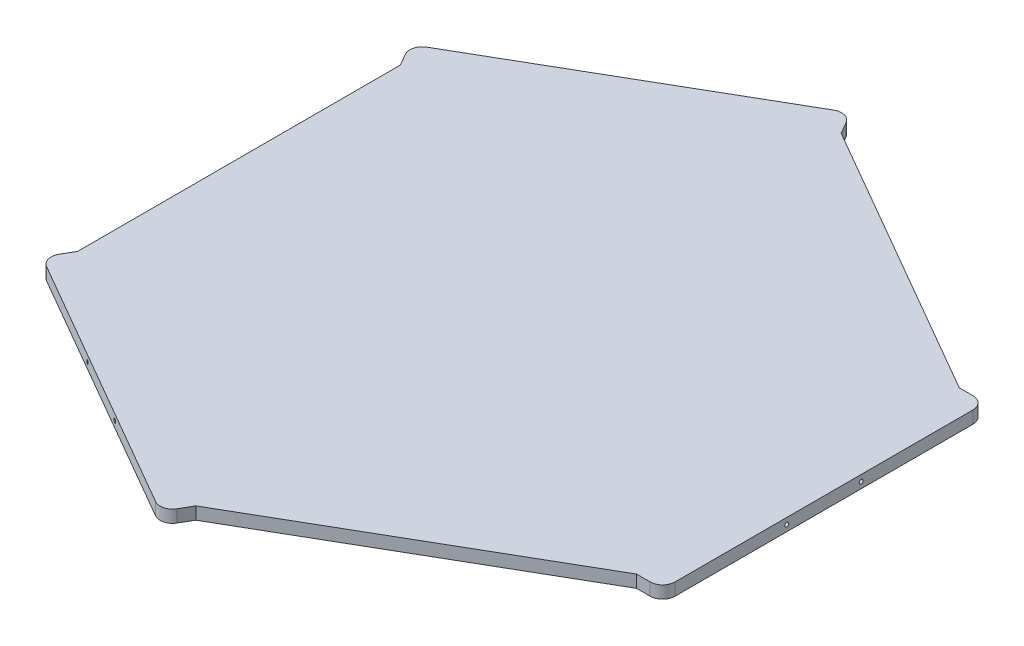
ISO-10303-21;
HEADER;
FILE_DESCRIPTION(('STEP AP214'),'2;1');
FILE_NAME('part.step','',(''),(''),'','','');
FILE_SCHEMA(('AUTOMOTIVE_DESIGN { 1 0 10303 214 1 1 1 1 }'));
ENDSEC;
DATA;
#1=APPLICATION_CONTEXT('core data for automotive mechanical design processes');
#2=APPLICATION_PROTOCOL_DEFINITION('international standard','automotive_design',2000,#1);
#3=PRODUCT_CONTEXT('',#1,'mechanical');
#4=PRODUCT('Part','Part','',(#3));
#5=PRODUCT_RELATED_PRODUCT_CATEGORY('part','',(#4));
#6=PRODUCT_DEFINITION_FORMATION('','',#4);
#7=PRODUCT_DEFINITION_CONTEXT('part definition',#1,'design');
#8=PRODUCT_DEFINITION('design','',#6,#7);
#9=PRODUCT_DEFINITION_SHAPE('','',#8);
#10=(LENGTH_UNIT() NAMED_UNIT(*) SI_UNIT(.MILLI.,.METRE.));
#11=(NAMED_UNIT(*) PLANE_ANGLE_UNIT() SI_UNIT($,.RADIAN.));
#12=(NAMED_UNIT(*) SI_UNIT($,.STERADIAN.) SOLID_ANGLE_UNIT());
#13=UNCERTAINTY_MEASURE_WITH_UNIT(LENGTH_MEASURE(1.E-05),#10,'distance_accuracy_value','');
#14=(GEOMETRIC_REPRESENTATION_CONTEXT(3) GLOBAL_UNCERTAINTY_ASSIGNED_CONTEXT((#13)) GLOBAL_UNIT_ASSIGNED_CONTEXT((#10,
#11,#12)) REPRESENTATION_CONTEXT('',''));
#15=CARTESIAN_POINT('',(0.,0.,0.));
#16=DIRECTION('',(0.,0.,1.));
#17=DIRECTION('',(1.,0.,0.));
#18=AXIS2_PLACEMENT_3D('',#15,#16,#17);
#19=CARTESIAN_POINT('',(56.2916512459885,5.,-97.5));
#20=DIRECTION('',(-0.5,0.,0.866025403784439));
#21=DIRECTION('',(0.866025403784439,0.,0.5));
#22=AXIS2_PLACEMENT_3D('',#19,#20,#21);
#23=PLANE('',#22);
#24=DIRECTION('',(-0.866025403784439,0.,-0.5));
#25=VECTOR('',#24,1.);
#26=CARTESIAN_POINT('',(56.2916512459885,0.,-97.5));
#27=LINE('',#26,#25);
#28=CARTESIAN_POINT('',(112.583302491977,0.,-65.));
#29=VERTEX_POINT('',#28);
#30=CARTESIAN_POINT('',(0.,0.,-130.));
#31=VERTEX_POINT('',#30);
#32=EDGE_CURVE('E216',#29,#31,#27,.T.);
#33=ORIENTED_EDGE('',*,*,#32,.T.);
#34=DIRECTION('',(0.,-1.,0.));
#35=VECTOR('',#34,1.);
#36=CARTESIAN_POINT('',(0.,5.,-130.));
#37=LINE('',#36,#35);
#38=CARTESIAN_POINT('',(0.,5.,-130.));
#39=VERTEX_POINT('',#38);
#40=EDGE_CURVE('E11',#39,#31,#37,.T.);
#41=ORIENTED_EDGE('',*,*,#40,.F.);
#42=DIRECTION('',(-0.866025403784439,0.,-0.5));
#43=VECTOR('',#42,1.);
#44=CARTESIAN_POINT('',(56.2916512459885,5.,-97.5));
#45=LINE('',#44,#43);
#46=CARTESIAN_POINT('',(112.583302491977,5.,-65.));
#47=VERTEX_POINT('',#46);
#48=EDGE_CURVE('E281',#47,#39,#45,.T.);
#49=ORIENTED_EDGE('',*,*,#48,.F.);
#50=DIRECTION('',(0.,-1.,0.));
#51=VECTOR('',#50,1.);
#52=CARTESIAN_POINT('',(112.583302491977,5.,-65.));
#53=LINE('',#52,#51);
#54=EDGE_CURVE('E66',#47,#29,#53,.T.);
#55=ORIENTED_EDGE('',*,*,#54,.T.);
#56=EDGE_LOOP('',(#33,#41,#49,#55));
#57=FACE_BOUND('',#56,.T.);
#58=ADVANCED_FACE('F49',(#57),#23,.F.);
#59=CARTESIAN_POINT('',(56.2916512459889,5.,-32.5000000000006));
#60=DIRECTION('',(-0.866025403784436,0.,0.500000000000004));
#61=DIRECTION('',(0.500000000000004,0.,0.866025403784436));
#62=AXIS2_PLACEMENT_3D('',#59,#60,#61);
#63=PLANE('',#62);
#64=DIRECTION('',(-0.500000000000005,0.,-0.866025403784436));
#65=VECTOR('',#64,1.);
#66=CARTESIAN_POINT('',(56.2916512459889,0.,-32.5000000000006));
#67=LINE('',#66,#65);
#68=CARTESIAN_POINT('',(-2.75,0.,-134.763139720814));
#69=VERTEX_POINT('',#68);
#70=EDGE_CURVE('E219',#31,#69,#67,.T.);
#71=ORIENTED_EDGE('',*,*,#70,.T.);
#72=DIRECTION('',(0.,-1.,0.));
#73=VECTOR('',#72,1.);
#74=CARTESIAN_POINT('',(-2.75,5.,-134.763139720814));
#75=LINE('',#74,#73);
#76=CARTESIAN_POINT('',(-2.75,5.,-134.763139720814));
#77=VERTEX_POINT('',#76);
#78=EDGE_CURVE('E58',#77,#69,#75,.T.);
#79=ORIENTED_EDGE('',*,*,#78,.F.);
#80=DIRECTION('',(-0.500000000000005,0.,-0.866025403784436));
#81=VECTOR('',#80,1.);
#82=CARTESIAN_POINT('',(56.2916512459889,5.,-32.5000000000006));
#83=LINE('',#82,#81);
#84=EDGE_CURVE('E136',#39,#77,#83,.T.);
#85=ORIENTED_EDGE('',*,*,#84,.F.);
#86=ORIENTED_EDGE('',*,*,#40,.T.);
#87=EDGE_LOOP('',(#71,#79,#85,#86));
#88=FACE_BOUND('',#87,.T.);
#89=ADVANCED_FACE('F334',(#88),#63,.F.);
#90=CARTESIAN_POINT('',(-7.0801270189222,5.,-132.263139720814));
#91=DIRECTION('',(0.,-1.,0.));
#92=DIRECTION('',(0.,0.,-1.));
#93=AXIS2_PLACEMENT_3D('',#90,#91,#92);
#94=CYLINDRICAL_SURFACE('',#93,4.99999999999998);
#95=CARTESIAN_POINT('',(-7.0801270189222,0.,-132.263139720814));
#96=DIRECTION('',(0.,1.,0.));
#97=DIRECTION('',(0.,0.,1.));
#98=AXIS2_PLACEMENT_3D('',#95,#96,#97);
#99=CIRCLE('',#98,4.99999999999998);
#100=CARTESIAN_POINT('',(-9.58012701892218,0.,-136.593266739737));
#101=VERTEX_POINT('',#100);
#102=EDGE_CURVE('E224',#101,#69,#99,.F.);
#103=ORIENTED_EDGE('',*,*,#102,.F.);
#104=DIRECTION('',(0.,-1.,0.));
#105=VECTOR('',#104,1.);
#106=CARTESIAN_POINT('',(-9.58012701892218,5.,-136.593266739737));
#107=LINE('',#106,#105);
#108=CARTESIAN_POINT('',(-9.58012701892218,5.,-136.593266739737));
#109=VERTEX_POINT('',#108);
#110=EDGE_CURVE('E325',#109,#101,#107,.T.);
#111=ORIENTED_EDGE('',*,*,#110,.F.);
#112=CARTESIAN_POINT('',(-7.0801270189222,5.,-132.263139720814));
#113=DIRECTION('',(0.,1.,0.));
#114=DIRECTION('',(0.,0.,1.));
#115=AXIS2_PLACEMENT_3D('',#112,#113,#114);
#116=CIRCLE('',#115,4.99999999999998);
#117=EDGE_CURVE('E333',#109,#77,#116,.F.);
#118=ORIENTED_EDGE('',*,*,#117,.T.);
#119=ORIENTED_EDGE('',*,*,#78,.T.);
#120=EDGE_LOOP('',(#103,#111,#118,#119));
#121=FACE_BOUND('',#120,.T.);
#122=ADVANCED_FACE('F331',(#121),#94,.T.);
#123=CARTESIAN_POINT('',(-61.5416512459885,5.,-106.593266739737));
#124=DIRECTION('',(0.5,0.,0.866025403784439));
#125=DIRECTION('',(0.866025403784439,0.,-0.5));
#126=AXIS2_PLACEMENT_3D('',#123,#124,#125);
#127=PLANE('',#126);
#128=CARTESIAN_POINT('',(-74.5320323027551,2.49999999999999,-99.0932667397366));
#129=DIRECTION('',(-0.5,0.,-0.866025403784439));
#130=DIRECTION('',(-0.866025403784439,0.,0.5));
#131=AXIS2_PLACEMENT_3D('',#128,#129,#130);
#132=CIRCLE('',#131,0.79999999999999);
#133=CARTESIAN_POINT('',(-75.2248526257826,2.49999999999999,-98.6932667397366));
#134=VERTEX_POINT('',#133);
#135=EDGE_CURVE('E439',#134,#134,#132,.T.);
#136=ORIENTED_EDGE('',*,*,#135,.F.);
#137=EDGE_LOOP('',(#136));
#138=FACE_BOUND('',#137,.T.);
#139=CARTESIAN_POINT('',(-48.5512701892219,2.49999999999999,-114.093266739737));
#140=DIRECTION('',(-0.5,0.,-0.866025403784439));
#141=DIRECTION('',(-0.866025403784439,0.,0.5));
#142=AXIS2_PLACEMENT_3D('',#139,#140,#141);
#143=CIRCLE('',#142,0.79999999999999);
#144=CARTESIAN_POINT('',(-49.2440905122495,2.49999999999999,-113.693266739737));
#145=VERTEX_POINT('',#144);
#146=EDGE_CURVE('E431',#145,#145,#143,.T.);
#147=ORIENTED_EDGE('',*,*,#146,.F.);
#148=EDGE_LOOP('',(#147));
#149=FACE_BOUND('',#148,.T.);
#150=DIRECTION('',(-0.866025403784439,0.,0.5));
#151=VECTOR('',#150,1.);
#152=CARTESIAN_POINT('',(-61.5416512459885,0.,-106.593266739737));
#153=LINE('',#152,#151);
#154=CARTESIAN_POINT('',(-113.503175473055,0.,-76.5932667397366));
#155=VERTEX_POINT('',#154);
#156=EDGE_CURVE('E228',#101,#155,#153,.T.);
#157=ORIENTED_EDGE('',*,*,#156,.T.);
#158=DIRECTION('',(0.,-1.,0.));
#159=VECTOR('',#158,1.);
#160=CARTESIAN_POINT('',(-113.503175473055,5.,-76.5932667397366));
#161=LINE('',#160,#159);
#162=CARTESIAN_POINT('',(-113.503175473055,5.,-76.5932667397366));
#163=VERTEX_POINT('',#162);
#164=EDGE_CURVE('E322',#163,#155,#161,.T.);
#165=ORIENTED_EDGE('',*,*,#164,.F.);
#166=DIRECTION('',(-0.866025403784439,0.,0.5));
#167=VECTOR('',#166,1.);
#168=CARTESIAN_POINT('',(-61.5416512459885,5.,-106.593266739737));
#169=LINE('',#168,#167);
#170=EDGE_CURVE('E345',#109,#163,#169,.T.);
#171=ORIENTED_EDGE('',*,*,#170,.F.);
#172=ORIENTED_EDGE('',*,*,#110,.T.);
#173=EDGE_LOOP('',(#157,#165,#171,#172));
#174=FACE_BOUND('',#173,.T.);
#175=ADVANCED_FACE('F342',(#138,#149,#174),#127,.F.);
#176=CARTESIAN_POINT('',(-111.003175473055,5.,-72.2631397208145));
#177=DIRECTION('',(0.,-1.,0.));
#178=DIRECTION('',(0.,0.,-1.));
#179=AXIS2_PLACEMENT_3D('',#176,#177,#178);
#180=CYLINDRICAL_SURFACE('',#179,5.);
#181=CARTESIAN_POINT('',(-111.003175473055,0.,-72.2631397208145));
#182=DIRECTION('',(0.,1.,0.));
#183=DIRECTION('',(0.,0.,1.));
#184=AXIS2_PLACEMENT_3D('',#181,#182,#183);
#185=CIRCLE('',#184,5.);
#186=CARTESIAN_POINT('',(-115.333302491977,0.,-69.7631397208145));
#187=VERTEX_POINT('',#186);
#188=EDGE_CURVE('E232',#187,#155,#185,.F.);
#189=ORIENTED_EDGE('',*,*,#188,.F.);
#190=DIRECTION('',(0.,-1.,0.));
#191=VECTOR('',#190,1.);
#192=CARTESIAN_POINT('',(-115.333302491977,5.,-69.7631397208145));
#193=LINE('',#192,#191);
#194=CARTESIAN_POINT('',(-115.333302491977,5.,-69.7631397208145));
#195=VERTEX_POINT('',#194);
#196=EDGE_CURVE('E319',#195,#187,#193,.T.);
#197=ORIENTED_EDGE('',*,*,#196,.F.);
#198=CARTESIAN_POINT('',(-111.003175473055,5.,-72.2631397208145));
#199=DIRECTION('',(0.,1.,0.));
#200=DIRECTION('',(0.,0.,1.));
#201=AXIS2_PLACEMENT_3D('',#198,#199,#200);
#202=CIRCLE('',#201,5.);
#203=EDGE_CURVE('E348',#195,#163,#202,.F.);
#204=ORIENTED_EDGE('',*,*,#203,.T.);
#205=ORIENTED_EDGE('',*,*,#164,.T.);
#206=EDGE_LOOP('',(#189,#197,#204,#205));
#207=FACE_BOUND('',#206,.T.);
#208=ADVANCED_FACE('F499',(#207),#180,.T.);
#209=CARTESIAN_POINT('',(-56.2916512459882,5.,32.5));
#210=DIRECTION('',(-0.866025403784437,0.,0.500000000000002));
#211=DIRECTION('',(0.500000000000002,0.,0.866025403784437));
#212=AXIS2_PLACEMENT_3D('',#209,#210,#211);
#213=PLANE('',#212);
#214=DIRECTION('',(-0.500000000000002,0.,-0.866025403784437));
#215=VECTOR('',#214,1.);
#216=CARTESIAN_POINT('',(-56.2916512459882,0.,32.5));
#217=LINE('',#216,#215);
#218=CARTESIAN_POINT('',(-112.583302491977,0.,-65.));
#219=VERTEX_POINT('',#218);
#220=EDGE_CURVE('E236',#219,#187,#217,.T.);
#221=ORIENTED_EDGE('',*,*,#220,.F.);
#222=DIRECTION('',(0.,-1.,0.));
#223=VECTOR('',#222,1.);
#224=CARTESIAN_POINT('',(-112.583302491977,5.,-65.));
#225=LINE('',#224,#223);
#226=CARTESIAN_POINT('',(-112.583302491977,5.,-65.));
#227=VERTEX_POINT('',#226);
#228=EDGE_CURVE('E316',#227,#219,#225,.T.);
#229=ORIENTED_EDGE('',*,*,#228,.F.);
#230=DIRECTION('',(-0.500000000000002,0.,-0.866025403784437));
#231=VECTOR('',#230,1.);
#232=CARTESIAN_POINT('',(-56.2916512459882,5.,32.5));
#233=LINE('',#232,#231);
#234=EDGE_CURVE('E358',#227,#195,#233,.T.);
#235=ORIENTED_EDGE('',*,*,#234,.T.);
#236=ORIENTED_EDGE('',*,*,#196,.T.);
#237=EDGE_LOOP('',(#221,#229,#235,#236));
#238=FACE_BOUND('',#237,.T.);
#239=ADVANCED_FACE('F497',(#238),#213,.T.);
#240=CARTESIAN_POINT('',(-112.583302491977,5.,0.));
#241=DIRECTION('',(1.,0.,0.));
#242=DIRECTION('',(0.,0.,-1.));
#243=AXIS2_PLACEMENT_3D('',#240,#241,#242);
#244=PLANE('',#243);
#245=DIRECTION('',(0.,0.,1.));
#246=VECTOR('',#245,1.);
#247=CARTESIAN_POINT('',(-112.583302491977,0.,0.));
#248=LINE('',#247,#246);
#249=CARTESIAN_POINT('',(-112.583302491977,0.,65.));
#250=VERTEX_POINT('',#249);
#251=EDGE_CURVE('E240',#219,#250,#248,.T.);
#252=ORIENTED_EDGE('',*,*,#251,.T.);
#253=DIRECTION('',(0.,-1.,0.));
#254=VECTOR('',#253,1.);
#255=CARTESIAN_POINT('',(-112.583302491977,5.,65.));
#256=LINE('',#255,#254);
#257=CARTESIAN_POINT('',(-112.583302491977,5.,65.));
#258=VERTEX_POINT('',#257);
#259=EDGE_CURVE('E312',#258,#250,#256,.T.);
#260=ORIENTED_EDGE('',*,*,#259,.F.);
#261=DIRECTION('',(0.,0.,1.));
#262=VECTOR('',#261,1.);
#263=CARTESIAN_POINT('',(-112.583302491977,5.,0.));
#264=LINE('',#263,#262);
#265=EDGE_CURVE('E362',#227,#258,#264,.T.);
#266=ORIENTED_EDGE('',*,*,#265,.F.);
#267=ORIENTED_EDGE('',*,*,#228,.T.);
#268=EDGE_LOOP('',(#252,#260,#266,#267));
#269=FACE_BOUND('',#268,.T.);
#270=ADVANCED_FACE('F494',(#269),#244,.F.);
#271=CARTESIAN_POINT('',(-56.2916512459885,5.,-32.5));
#272=DIRECTION('',(0.866025403784439,0.,0.5));
#273=DIRECTION('',(0.5,0.,-0.866025403784439));
#274=AXIS2_PLACEMENT_3D('',#271,#272,#273);
#275=PLANE('',#274);
#276=DIRECTION('',(-0.5,0.,0.866025403784439));
#277=VECTOR('',#276,1.);
#278=CARTESIAN_POINT('',(-56.2916512459885,0.,-32.5));
#279=LINE('',#278,#277);
#280=CARTESIAN_POINT('',(-115.333302491977,0.,69.7631397208144));
#281=VERTEX_POINT('',#280);
#282=EDGE_CURVE('E243',#250,#281,#279,.T.);
#283=ORIENTED_EDGE('',*,*,#282,.T.);
#284=DIRECTION('',(0.,-1.,0.));
#285=VECTOR('',#284,1.);
#286=CARTESIAN_POINT('',(-115.333302491977,5.,69.7631397208144));
#287=LINE('',#286,#285);
#288=CARTESIAN_POINT('',(-115.333302491977,5.,69.7631397208144));
#289=VERTEX_POINT('',#288);
#290=EDGE_CURVE('E309',#289,#281,#287,.T.);
#291=ORIENTED_EDGE('',*,*,#290,.F.);
#292=DIRECTION('',(-0.5,0.,0.866025403784439));
#293=VECTOR('',#292,1.);
#294=CARTESIAN_POINT('',(-56.2916512459885,5.,-32.5));
#295=LINE('',#294,#293);
#296=EDGE_CURVE('E365',#258,#289,#295,.T.);
#297=ORIENTED_EDGE('',*,*,#296,.F.);
#298=ORIENTED_EDGE('',*,*,#259,.T.);
#299=EDGE_LOOP('',(#283,#291,#297,#298));
#300=FACE_BOUND('',#299,.T.);
#301=ADVANCED_FACE('F490',(#300),#275,.F.);
#302=CARTESIAN_POINT('',(-111.003175473055,5.,72.2631397208144));
#303=DIRECTION('',(0.,-1.,0.));
#304=DIRECTION('',(0.,0.,-1.));
#305=AXIS2_PLACEMENT_3D('',#302,#303,#304);
#306=CYLINDRICAL_SURFACE('',#305,4.99999999999999);
#307=CARTESIAN_POINT('',(-111.003175473055,0.,72.2631397208144));
#308=DIRECTION('',(0.,1.,0.));
#309=DIRECTION('',(0.,0.,1.));
#310=AXIS2_PLACEMENT_3D('',#307,#308,#309);
#311=CIRCLE('',#310,4.99999999999999);
#312=CARTESIAN_POINT('',(-113.503175473055,0.,76.5932667397366));
#313=VERTEX_POINT('',#312);
#314=EDGE_CURVE('E247',#313,#281,#311,.F.);
#315=ORIENTED_EDGE('',*,*,#314,.F.);
#316=DIRECTION('',(0.,-1.,0.));
#317=VECTOR('',#316,1.);
#318=CARTESIAN_POINT('',(-113.503175473055,5.,76.5932667397366));
#319=LINE('',#318,#317);
#320=CARTESIAN_POINT('',(-113.503175473055,5.,76.5932667397366));
#321=VERTEX_POINT('',#320);
#322=EDGE_CURVE('E306',#321,#313,#319,.T.);
#323=ORIENTED_EDGE('',*,*,#322,.F.);
#324=CARTESIAN_POINT('',(-111.003175473055,5.,72.2631397208144));
#325=DIRECTION('',(0.,1.,0.));
#326=DIRECTION('',(0.,0.,1.));
#327=AXIS2_PLACEMENT_3D('',#324,#325,#326);
#328=CIRCLE('',#327,4.99999999999999);
#329=EDGE_CURVE('E368',#321,#289,#328,.F.);
#330=ORIENTED_EDGE('',*,*,#329,.T.);
#331=ORIENTED_EDGE('',*,*,#290,.T.);
#332=EDGE_LOOP('',(#315,#323,#330,#331));
#333=FACE_BOUND('',#332,.T.);
#334=ADVANCED_FACE('F466',(#333),#306,.T.);
#335=CARTESIAN_POINT('',(-61.5416512459885,5.,106.593266739737));
#336=DIRECTION('',(0.5,0.,-0.866025403784439));
#337=DIRECTION('',(-0.866025403784439,0.,-0.5));
#338=AXIS2_PLACEMENT_3D('',#335,#336,#337);
#339=PLANE('',#338);
#340=CARTESIAN_POINT('',(-48.5512701892219,2.5,114.093266739737));
#341=DIRECTION('',(-0.5,0.,0.866025403784438));
#342=DIRECTION('',(0.866025403784439,0.,0.5));
#343=AXIS2_PLACEMENT_3D('',#340,#341,#342);
#344=CIRCLE('',#343,0.79999999999999);
#345=CARTESIAN_POINT('',(-47.8584498661944,2.5,114.493266739737));
#346=VERTEX_POINT('',#345);
#347=EDGE_CURVE('E455',#346,#346,#344,.T.);
#348=ORIENTED_EDGE('',*,*,#347,.F.);
#349=EDGE_LOOP('',(#348));
#350=FACE_BOUND('',#349,.T.);
#351=CARTESIAN_POINT('',(-74.5320323027551,2.5,99.0932667397366));
#352=DIRECTION('',(-0.5,0.,0.866025403784438));
#353=DIRECTION('',(0.866025403784439,0.,0.5));
#354=AXIS2_PLACEMENT_3D('',#351,#352,#353);
#355=CIRCLE('',#354,0.79999999999999);
#356=CARTESIAN_POINT('',(-73.8392119797276,2.5,99.4932667397366));
#357=VERTEX_POINT('',#356);
#358=EDGE_CURVE('E447',#357,#357,#355,.T.);
#359=ORIENTED_EDGE('',*,*,#358,.F.);
#360=EDGE_LOOP('',(#359));
#361=FACE_BOUND('',#360,.T.);
#362=DIRECTION('',(0.866025403784439,0.,0.5));
#363=VECTOR('',#362,1.);
#364=CARTESIAN_POINT('',(-61.5416512459885,0.,106.593266739737));
#365=LINE('',#364,#363);
#366=CARTESIAN_POINT('',(-9.58012701892222,0.,136.593266739737));
#367=VERTEX_POINT('',#366);
#368=EDGE_CURVE('E251',#313,#367,#365,.T.);
#369=ORIENTED_EDGE('',*,*,#368,.T.);
#370=DIRECTION('',(0.,-1.,0.));
#371=VECTOR('',#370,1.);
#372=CARTESIAN_POINT('',(-9.58012701892222,5.,136.593266739737));
#373=LINE('',#372,#371);
#374=CARTESIAN_POINT('',(-9.58012701892222,5.,136.593266739737));
#375=VERTEX_POINT('',#374);
#376=EDGE_CURVE('E302',#375,#367,#373,.T.);
#377=ORIENTED_EDGE('',*,*,#376,.F.);
#378=DIRECTION('',(0.866025403784439,0.,0.5));
#379=VECTOR('',#378,1.);
#380=CARTESIAN_POINT('',(-61.5416512459885,5.,106.593266739737));
#381=LINE('',#380,#379);
#382=EDGE_CURVE('E372',#321,#375,#381,.T.);
#383=ORIENTED_EDGE('',*,*,#382,.F.);
#384=ORIENTED_EDGE('',*,*,#322,.T.);
#385=EDGE_LOOP('',(#369,#377,#383,#384));
#386=FACE_BOUND('',#385,.T.);
#387=ADVANCED_FACE('F462',(#350,#361,#386),#339,.F.);
#388=CARTESIAN_POINT('',(-7.08012701892223,5.,132.263139720814));
#389=DIRECTION('',(0.,-1.,0.));
#390=DIRECTION('',(0.,0.,-1.));
#391=AXIS2_PLACEMENT_3D('',#388,#389,#390);
#392=CYLINDRICAL_SURFACE('',#391,5.);
#393=CARTESIAN_POINT('',(-7.08012701892223,0.,132.263139720814));
#394=DIRECTION('',(0.,1.,0.));
#395=DIRECTION('',(0.,0.,1.));
#396=AXIS2_PLACEMENT_3D('',#393,#394,#395);
#397=CIRCLE('',#396,5.);
#398=CARTESIAN_POINT('',(-2.75000000000003,0.,134.763139720814));
#399=VERTEX_POINT('',#398);
#400=EDGE_CURVE('E254',#367,#399,#397,.T.);
#401=ORIENTED_EDGE('',*,*,#400,.T.);
#402=DIRECTION('',(0.,-1.,0.));
#403=VECTOR('',#402,1.);
#404=CARTESIAN_POINT('',(-2.75000000000003,5.,134.763139720814));
#405=LINE('',#404,#403);
#406=CARTESIAN_POINT('',(-2.75000000000003,5.,134.763139720814));
#407=VERTEX_POINT('',#406);
#408=EDGE_CURVE('E299',#407,#399,#405,.T.);
#409=ORIENTED_EDGE('',*,*,#408,.F.);
#410=CARTESIAN_POINT('',(-7.08012701892223,5.,132.263139720814));
#411=DIRECTION('',(0.,1.,0.));
#412=DIRECTION('',(0.,0.,1.));
#413=AXIS2_PLACEMENT_3D('',#410,#411,#412);
#414=CIRCLE('',#413,5.);
#415=EDGE_CURVE('E375',#375,#407,#414,.T.);
#416=ORIENTED_EDGE('',*,*,#415,.F.);
#417=ORIENTED_EDGE('',*,*,#376,.T.);
#418=EDGE_LOOP('',(#401,#409,#416,#417));
#419=FACE_BOUND('',#418,.T.);
#420=ADVANCED_FACE('F465',(#419),#392,.T.);
#421=CARTESIAN_POINT('',(56.2916512459888,5.,32.5000000000006));
#422=DIRECTION('',(0.866025403784436,0.,0.500000000000004));
#423=DIRECTION('',(0.500000000000004,0.,-0.866025403784436));
#424=AXIS2_PLACEMENT_3D('',#421,#422,#423);
#425=PLANE('',#424);
#426=DIRECTION('',(-0.500000000000004,0.,0.866025403784436));
#427=VECTOR('',#426,1.);
#428=CARTESIAN_POINT('',(56.2916512459888,0.,32.5000000000006));
#429=LINE('',#428,#427);
#430=CARTESIAN_POINT('',(0.,0.,130.));
#431=VERTEX_POINT('',#430);
#432=EDGE_CURVE('E258',#431,#399,#429,.T.);
#433=ORIENTED_EDGE('',*,*,#432,.F.);
#434=DIRECTION('',(0.,-1.,0.));
#435=VECTOR('',#434,1.);
#436=CARTESIAN_POINT('',(0.,5.,130.));
#437=LINE('',#436,#435);
#438=CARTESIAN_POINT('',(0.,5.,130.));
#439=VERTEX_POINT('',#438);
#440=EDGE_CURVE('E296',#439,#431,#437,.T.);
#441=ORIENTED_EDGE('',*,*,#440,.F.);
#442=DIRECTION('',(-0.500000000000004,0.,0.866025403784436));
#443=VECTOR('',#442,1.);
#444=CARTESIAN_POINT('',(56.2916512459888,5.,32.5000000000006));
#445=LINE('',#444,#443);
#446=EDGE_CURVE('E378',#439,#407,#445,.T.);
#447=ORIENTED_EDGE('',*,*,#446,.T.);
#448=ORIENTED_EDGE('',*,*,#408,.T.);
#449=EDGE_LOOP('',(#433,#441,#447,#448));
#450=FACE_BOUND('',#449,.T.);
#451=ADVANCED_FACE('F481',(#450),#425,.T.);
#452=CARTESIAN_POINT('',(56.2916512459885,5.,97.5000000000001));
#453=DIRECTION('',(-0.5,0.,-0.866025403784439));
#454=DIRECTION('',(-0.866025403784439,0.,0.5));
#455=AXIS2_PLACEMENT_3D('',#452,#453,#454);
#456=PLANE('',#455);
#457=DIRECTION('',(0.866025403784439,0.,-0.5));
#458=VECTOR('',#457,1.);
#459=CARTESIAN_POINT('',(56.2916512459885,0.,97.5000000000001));
#460=LINE('',#459,#458);
#461=CARTESIAN_POINT('',(112.583302491977,0.,65.0000000000001));
#462=VERTEX_POINT('',#461);
#463=EDGE_CURVE('E262',#431,#462,#460,.T.);
#464=ORIENTED_EDGE('',*,*,#463,.T.);
#465=DIRECTION('',(0.,-1.,0.));
#466=VECTOR('',#465,1.);
#467=CARTESIAN_POINT('',(112.583302491977,5.,65.0000000000001));
#468=LINE('',#467,#466);
#469=CARTESIAN_POINT('',(112.583302491977,5.,65.0000000000001));
#470=VERTEX_POINT('',#469);
#471=EDGE_CURVE('E292',#470,#462,#468,.T.);
#472=ORIENTED_EDGE('',*,*,#471,.F.);
#473=DIRECTION('',(0.866025403784439,0.,-0.5));
#474=VECTOR('',#473,1.);
#475=CARTESIAN_POINT('',(56.2916512459885,5.,97.5000000000001));
#476=LINE('',#475,#474);
#477=EDGE_CURVE('E382',#439,#470,#476,.T.);
#478=ORIENTED_EDGE('',*,*,#477,.F.);
#479=ORIENTED_EDGE('',*,*,#440,.T.);
#480=EDGE_LOOP('',(#464,#472,#478,#479));
#481=FACE_BOUND('',#480,.T.);
#482=ADVANCED_FACE('F722',(#481),#456,.F.);
#483=CARTESIAN_POINT('',(4.9203065864071E-13,5.,65.0000000000009));
#484=DIRECTION('',(0.,0.,-1.));
#485=DIRECTION('',(-1.,0.,0.));
#486=AXIS2_PLACEMENT_3D('',#483,#484,#485);
#487=PLANE('',#486);
#488=DIRECTION('',(1.,0.,0.));
#489=VECTOR('',#488,1.);
#490=CARTESIAN_POINT('',(4.9203065864071E-13,0.,65.0000000000009));
#491=LINE('',#490,#489);
#492=CARTESIAN_POINT('',(118.083302491977,0.,65.));
#493=VERTEX_POINT('',#492);
#494=EDGE_CURVE('E265',#462,#493,#491,.T.);
#495=ORIENTED_EDGE('',*,*,#494,.T.);
#496=DIRECTION('',(0.,-1.,0.));
#497=VECTOR('',#496,1.);
#498=CARTESIAN_POINT('',(118.083302491977,5.,65.));
#499=LINE('',#498,#497);
#500=CARTESIAN_POINT('',(118.083302491977,5.,65.));
#501=VERTEX_POINT('',#500);
#502=EDGE_CURVE('E288',#501,#493,#499,.T.);
#503=ORIENTED_EDGE('',*,*,#502,.F.);
#504=DIRECTION('',(1.,0.,0.));
#505=VECTOR('',#504,1.);
#506=CARTESIAN_POINT('',(4.9203065864071E-13,5.,65.0000000000009));
#507=LINE('',#506,#505);
#508=EDGE_CURVE('E210',#470,#501,#507,.T.);
#509=ORIENTED_EDGE('',*,*,#508,.F.);
#510=ORIENTED_EDGE('',*,*,#471,.T.);
#511=EDGE_LOOP('',(#495,#503,#509,#510));
#512=FACE_BOUND('',#511,.T.);
#513=ADVANCED_FACE('F391',(#512),#487,.F.);
#514=CARTESIAN_POINT('',(118.083302491977,5.,60.));
#515=DIRECTION('',(0.,-1.,0.));
#516=DIRECTION('',(0.,0.,-1.));
#517=AXIS2_PLACEMENT_3D('',#514,#515,#516);
#518=CYLINDRICAL_SURFACE('',#517,4.99999999999999);
#519=CARTESIAN_POINT('',(118.083302491977,0.,60.));
#520=DIRECTION('',(0.,1.,0.));
#521=DIRECTION('',(0.,0.,1.));
#522=AXIS2_PLACEMENT_3D('',#519,#520,#521);
#523=CIRCLE('',#522,4.99999999999999);
#524=CARTESIAN_POINT('',(123.083302491977,0.,60.));
#525=VERTEX_POINT('',#524);
#526=EDGE_CURVE('E268',#493,#525,#523,.T.);
#527=ORIENTED_EDGE('',*,*,#526,.T.);
#528=DIRECTION('',(0.,-1.,0.));
#529=VECTOR('',#528,1.);
#530=CARTESIAN_POINT('',(123.083302491977,5.,60.));
#531=LINE('',#530,#529);
#532=CARTESIAN_POINT('',(123.083302491977,5.,60.));
#533=VERTEX_POINT('',#532);
#534=EDGE_CURVE('E194',#533,#525,#531,.T.);
#535=ORIENTED_EDGE('',*,*,#534,.F.);
#536=CARTESIAN_POINT('',(118.083302491977,5.,60.));
#537=DIRECTION('',(0.,1.,0.));
#538=DIRECTION('',(0.,0.,1.));
#539=AXIS2_PLACEMENT_3D('',#536,#537,#538);
#540=CIRCLE('',#539,4.99999999999999);
#541=EDGE_CURVE('E205',#501,#533,#540,.T.);
#542=ORIENTED_EDGE('',*,*,#541,.F.);
#543=ORIENTED_EDGE('',*,*,#502,.T.);
#544=EDGE_LOOP('',(#527,#535,#542,#543));
#545=FACE_BOUND('',#544,.T.);
#546=ADVANCED_FACE('F395',(#545),#518,.T.);
#547=CARTESIAN_POINT('',(123.083302491977,5.,0.));
#548=DIRECTION('',(1.,0.,0.));
#549=DIRECTION('',(0.,0.,-1.));
#550=AXIS2_PLACEMENT_3D('',#547,#548,#549);
#551=PLANE('',#550);
#552=CARTESIAN_POINT('',(123.083302491977,2.5,15.));
#553=DIRECTION('',(1.,0.,0.));
#554=DIRECTION('',(0.,0.,-1.));
#555=AXIS2_PLACEMENT_3D('',#552,#553,#554);
#556=CIRCLE('',#555,0.79999999999999);
#557=CARTESIAN_POINT('',(123.083302491977,2.5,14.2));
#558=VERTEX_POINT('',#557);
#559=EDGE_CURVE('E423',#558,#558,#556,.T.);
#560=ORIENTED_EDGE('',*,*,#559,.F.);
#561=EDGE_LOOP('',(#560));
#562=FACE_BOUND('',#561,.T.);
#563=CARTESIAN_POINT('',(123.083302491977,2.5,-15.));
#564=DIRECTION('',(1.,0.,0.));
#565=DIRECTION('',(0.,0.,-1.));
#566=AXIS2_PLACEMENT_3D('',#563,#564,#565);
#567=CIRCLE('',#566,0.79999999999999);
#568=CARTESIAN_POINT('',(123.083302491977,2.5,-15.8));
#569=VERTEX_POINT('',#568);
#570=EDGE_CURVE('E415',#569,#569,#567,.T.);
#571=ORIENTED_EDGE('',*,*,#570,.F.);
#572=EDGE_LOOP('',(#571));
#573=FACE_BOUND('',#572,.T.);
#574=DIRECTION('',(0.,0.,1.));
#575=VECTOR('',#574,1.);
#576=CARTESIAN_POINT('',(123.083302491977,0.,0.));
#577=LINE('',#576,#575);
#578=CARTESIAN_POINT('',(123.083302491977,0.,-60.0000000000001));
#579=VERTEX_POINT('',#578);
#580=EDGE_CURVE('E190',#579,#525,#577,.T.);
#581=ORIENTED_EDGE('',*,*,#580,.F.);
#582=DIRECTION('',(0.,-1.,0.));
#583=VECTOR('',#582,1.);
#584=CARTESIAN_POINT('',(123.083302491977,5.,-60.0000000000001));
#585=LINE('',#584,#583);
#586=CARTESIAN_POINT('',(123.083302491977,5.,-60.0000000000001));
#587=VERTEX_POINT('',#586);
#588=EDGE_CURVE('E184',#587,#579,#585,.T.);
#589=ORIENTED_EDGE('',*,*,#588,.F.);
#590=DIRECTION('',(0.,0.,1.));
#591=VECTOR('',#590,1.);
#592=CARTESIAN_POINT('',(123.083302491977,5.,0.));
#593=LINE('',#592,#591);
#594=EDGE_CURVE('E188',#587,#533,#593,.T.);
#595=ORIENTED_EDGE('',*,*,#594,.T.);
#596=ORIENTED_EDGE('',*,*,#534,.T.);
#597=EDGE_LOOP('',(#581,#589,#595,#596));
#598=FACE_BOUND('',#597,.T.);
#599=ADVANCED_FACE('F186',(#562,#573,#598),#551,.T.);
#600=CARTESIAN_POINT('',(118.083302491977,5.,-60.0000000000001));
#601=DIRECTION('',(0.,-1.,0.));
#602=DIRECTION('',(0.,0.,-1.));
#603=AXIS2_PLACEMENT_3D('',#600,#601,#602);
#604=CYLINDRICAL_SURFACE('',#603,5.);
#605=CARTESIAN_POINT('',(118.083302491977,0.,-60.0000000000001));
#606=DIRECTION('',(0.,1.,0.));
#607=DIRECTION('',(0.,0.,1.));
#608=AXIS2_PLACEMENT_3D('',#605,#606,#607);
#609=CIRCLE('',#608,5.);
#610=CARTESIAN_POINT('',(118.083302491977,0.,-65.0000000000001));
#611=VERTEX_POINT('',#610);
#612=EDGE_CURVE('E274',#579,#611,#609,.T.);
#613=ORIENTED_EDGE('',*,*,#612,.T.);
#614=DIRECTION('',(0.,-1.,0.));
#615=VECTOR('',#614,1.);
#616=CARTESIAN_POINT('',(118.083302491977,5.,-65.0000000000001));
#617=LINE('',#616,#615);
#618=CARTESIAN_POINT('',(118.083302491977,5.,-65.0000000000001));
#619=VERTEX_POINT('',#618);
#620=EDGE_CURVE('E124',#619,#611,#617,.T.);
#621=ORIENTED_EDGE('',*,*,#620,.F.);
#622=CARTESIAN_POINT('',(118.083302491977,5.,-60.0000000000001));
#623=DIRECTION('',(0.,1.,0.));
#624=DIRECTION('',(0.,0.,1.));
#625=AXIS2_PLACEMENT_3D('',#622,#623,#624);
#626=CIRCLE('',#625,5.);
#627=EDGE_CURVE('E196',#587,#619,#626,.T.);
#628=ORIENTED_EDGE('',*,*,#627,.F.);
#629=ORIENTED_EDGE('',*,*,#588,.T.);
#630=EDGE_LOOP('',(#613,#621,#628,#629));
#631=FACE_BOUND('',#630,.T.);
#632=ADVANCED_FACE('F197',(#631),#604,.T.);
#633=CARTESIAN_POINT('',(-9.84061317281382E-13,5.,-64.9999999999983));
#634=DIRECTION('',(0.,0.,-1.));
#635=DIRECTION('',(-1.,0.,0.));
#636=AXIS2_PLACEMENT_3D('',#633,#634,#635);
#637=PLANE('',#636);
#638=DIRECTION('',(1.,0.,0.));
#639=VECTOR('',#638,1.);
#640=CARTESIAN_POINT('',(-9.84061317281382E-13,0.,-64.9999999999983));
#641=LINE('',#640,#639);
#642=EDGE_CURVE('E277',#29,#611,#641,.T.);
#643=ORIENTED_EDGE('',*,*,#642,.F.);
#644=ORIENTED_EDGE('',*,*,#54,.F.);
#645=DIRECTION('',(1.,0.,0.));
#646=VECTOR('',#645,1.);
#647=CARTESIAN_POINT('',(-9.84061317281382E-13,5.,-64.9999999999983));
#648=LINE('',#647,#646);
#649=EDGE_CURVE('E201',#47,#619,#648,.T.);
#650=ORIENTED_EDGE('',*,*,#649,.T.);
#651=ORIENTED_EDGE('',*,*,#620,.T.);
#652=EDGE_LOOP('',(#643,#644,#650,#651));
#653=FACE_BOUND('',#652,.T.);
#654=ADVANCED_FACE('F396',(#653),#637,.T.);
#655=CARTESIAN_POINT('',(0.,5.,0.));
#656=DIRECTION('',(0.,1.,0.));
#657=DIRECTION('',(0.,0.,1.));
#658=AXIS2_PLACEMENT_3D('',#655,#656,#657);
#659=PLANE('',#658);
#660=ORIENTED_EDGE('',*,*,#48,.T.);
#661=ORIENTED_EDGE('',*,*,#84,.T.);
#662=ORIENTED_EDGE('',*,*,#117,.F.);
#663=ORIENTED_EDGE('',*,*,#170,.T.);
#664=ORIENTED_EDGE('',*,*,#203,.F.);
#665=ORIENTED_EDGE('',*,*,#234,.F.);
#666=ORIENTED_EDGE('',*,*,#265,.T.);
#667=ORIENTED_EDGE('',*,*,#296,.T.);
#668=ORIENTED_EDGE('',*,*,#329,.F.);
#669=ORIENTED_EDGE('',*,*,#382,.T.);
#670=ORIENTED_EDGE('',*,*,#415,.T.);
#671=ORIENTED_EDGE('',*,*,#446,.F.);
#672=ORIENTED_EDGE('',*,*,#477,.T.);
#673=ORIENTED_EDGE('',*,*,#508,.T.);
#674=ORIENTED_EDGE('',*,*,#541,.T.);
#675=ORIENTED_EDGE('',*,*,#594,.F.);
#676=ORIENTED_EDGE('',*,*,#627,.T.);
#677=ORIENTED_EDGE('',*,*,#649,.F.);
#678=EDGE_LOOP('',(#660,#661,#662,#663,#664,#665,#666,#667,#668,#669,#670,#671,#672,#673,#674,
#675,#676,#677));
#679=FACE_BOUND('',#678,.T.);
#680=ADVANCED_FACE('F203',(#679),#659,.T.);
#681=CARTESIAN_POINT('',(0.,0.,0.));
#682=DIRECTION('',(0.,1.,0.));
#683=DIRECTION('',(0.,0.,1.));
#684=AXIS2_PLACEMENT_3D('',#681,#682,#683);
#685=PLANE('',#684);
#686=ORIENTED_EDGE('',*,*,#32,.F.);
#687=ORIENTED_EDGE('',*,*,#642,.T.);
#688=ORIENTED_EDGE('',*,*,#612,.F.);
#689=ORIENTED_EDGE('',*,*,#580,.T.);
#690=ORIENTED_EDGE('',*,*,#526,.F.);
#691=ORIENTED_EDGE('',*,*,#494,.F.);
#692=ORIENTED_EDGE('',*,*,#463,.F.);
#693=ORIENTED_EDGE('',*,*,#432,.T.);
#694=ORIENTED_EDGE('',*,*,#400,.F.);
#695=ORIENTED_EDGE('',*,*,#368,.F.);
#696=ORIENTED_EDGE('',*,*,#314,.T.);
#697=ORIENTED_EDGE('',*,*,#282,.F.);
#698=ORIENTED_EDGE('',*,*,#251,.F.);
#699=ORIENTED_EDGE('',*,*,#220,.T.);
#700=ORIENTED_EDGE('',*,*,#188,.T.);
#701=ORIENTED_EDGE('',*,*,#156,.F.);
#702=ORIENTED_EDGE('',*,*,#102,.T.);
#703=ORIENTED_EDGE('',*,*,#70,.F.);
#704=EDGE_LOOP('',(#686,#687,#688,#689,#690,#691,#692,#693,#694,#695,#696,#697,#698,#699,#700,
#701,#702,#703));
#705=FACE_BOUND('',#704,.T.);
#706=ADVANCED_FACE('F338',(#705),#685,.F.);
#707=CARTESIAN_POINT('',(116.363990987199,2.5,-15.));
#708=DIRECTION('',(1.,0.,0.));
#709=DIRECTION('',(0.,0.,-1.));
#710=AXIS2_PLACEMENT_3D('',#707,#708,#709);
#711=CONICAL_SURFACE('',#710,0.799999999999998,1.02974425867665);
#712=CARTESIAN_POINT('',(115.883302491977,2.5,-15.));
#713=VERTEX_POINT('',#712);
#714=VERTEX_LOOP('',#713);
#715=FACE_BOUND('',#714,.T.);
#716=CARTESIAN_POINT('',(116.363990987199,2.5,-15.));
#717=DIRECTION('',(1.,0.,0.));
#718=DIRECTION('',(0.,0.,-1.));
#719=AXIS2_PLACEMENT_3D('',#716,#717,#718);
#720=CIRCLE('',#719,0.799999999999998);
#721=CARTESIAN_POINT('',(116.363990987199,2.5,-15.8));
#722=VERTEX_POINT('',#721);
#723=EDGE_CURVE('E220',#722,#722,#720,.T.);
#724=ORIENTED_EDGE('',*,*,#723,.T.);
#725=EDGE_LOOP('',(#724));
#726=FACE_BOUND('',#725,.T.);
#727=ADVANCED_FACE('F647',(#715,#726),#711,.F.);
#728=CARTESIAN_POINT('',(123.083302491977,2.5,-15.));
#729=DIRECTION('',(1.,0.,0.));
#730=DIRECTION('',(0.,0.,-1.));
#731=AXIS2_PLACEMENT_3D('',#728,#729,#730);
#732=CYLINDRICAL_SURFACE('',#731,0.799999999999994);
#733=ORIENTED_EDGE('',*,*,#723,.F.);
#734=EDGE_LOOP('',(#733));
#735=FACE_BOUND('',#734,.T.);
#736=ORIENTED_EDGE('',*,*,#570,.T.);
#737=EDGE_LOOP('',(#736));
#738=FACE_BOUND('',#737,.T.);
#739=ADVANCED_FACE('F641',(#735,#738),#732,.F.);
#740=CARTESIAN_POINT('',(116.363990987199,2.5,15.));
#741=DIRECTION('',(1.,0.,0.));
#742=DIRECTION('',(0.,0.,-1.));
#743=AXIS2_PLACEMENT_3D('',#740,#741,#742);
#744=CONICAL_SURFACE('',#743,0.799999999999998,1.02974425867665);
#745=CARTESIAN_POINT('',(115.883302491977,2.5,15.));
#746=VERTEX_POINT('',#745);
#747=VERTEX_LOOP('',#746);
#748=FACE_BOUND('',#747,.T.);
#749=CARTESIAN_POINT('',(116.363990987199,2.5,15.));
#750=DIRECTION('',(1.,0.,0.));
#751=DIRECTION('',(0.,0.,-1.));
#752=AXIS2_PLACEMENT_3D('',#749,#750,#751);
#753=CIRCLE('',#752,0.799999999999998);
#754=CARTESIAN_POINT('',(116.363990987199,2.5,14.2));
#755=VERTEX_POINT('',#754);
#756=EDGE_CURVE('E419',#755,#755,#753,.T.);
#757=ORIENTED_EDGE('',*,*,#756,.T.);
#758=EDGE_LOOP('',(#757));
#759=FACE_BOUND('',#758,.T.);
#760=ADVANCED_FACE('F646',(#748,#759),#744,.F.);
#761=CARTESIAN_POINT('',(123.083302491977,2.5,15.));
#762=DIRECTION('',(1.,0.,0.));
#763=DIRECTION('',(0.,0.,-1.));
#764=AXIS2_PLACEMENT_3D('',#761,#762,#763);
#765=CYLINDRICAL_SURFACE('',#764,0.799999999999994);
#766=ORIENTED_EDGE('',*,*,#756,.F.);
#767=EDGE_LOOP('',(#766));
#768=FACE_BOUND('',#767,.T.);
#769=ORIENTED_EDGE('',*,*,#559,.T.);
#770=EDGE_LOOP('',(#769));
#771=FACE_BOUND('',#770,.T.);
#772=ADVANCED_FACE('F528',(#768,#771),#765,.F.);
#773=CARTESIAN_POINT('',(-45.1916144368329,2.49999999999999,-108.274172280658));
#774=DIRECTION('',(-0.5,0.,-0.866025403784439));
#775=DIRECTION('',(-0.866025403784439,0.,0.5));
#776=AXIS2_PLACEMENT_3D('',#773,#774,#775);
#777=CONICAL_SURFACE('',#776,0.799999999999999,1.02974425867665);
#778=CARTESIAN_POINT('',(-44.9512701892219,2.49999999999999,-107.857883832489));
#779=VERTEX_POINT('',#778);
#780=VERTEX_LOOP('',#779);
#781=FACE_BOUND('',#780,.T.);
#782=CARTESIAN_POINT('',(-45.1916144368329,2.49999999999999,-108.274172280658));
#783=DIRECTION('',(-0.5,0.,-0.866025403784439));
#784=DIRECTION('',(-0.866025403784439,0.,0.5));
#785=AXIS2_PLACEMENT_3D('',#782,#783,#784);
#786=CIRCLE('',#785,0.799999999999999);
#787=CARTESIAN_POINT('',(-45.8844347598605,2.49999999999999,-107.874172280658));
#788=VERTEX_POINT('',#787);
#789=EDGE_CURVE('E427',#788,#788,#786,.T.);
#790=ORIENTED_EDGE('',*,*,#789,.T.);
#791=EDGE_LOOP('',(#790));
#792=FACE_BOUND('',#791,.T.);
#793=ADVANCED_FACE('F544',(#781,#792),#777,.F.);
#794=CARTESIAN_POINT('',(-48.5512701892219,2.49999999999999,-114.093266739737));
#795=DIRECTION('',(-0.5,0.,-0.866025403784439));
#796=DIRECTION('',(-0.866025403784439,0.,0.5));
#797=AXIS2_PLACEMENT_3D('',#794,#795,#796);
#798=CYLINDRICAL_SURFACE('',#797,0.799999999999994);
#799=ORIENTED_EDGE('',*,*,#789,.F.);
#800=EDGE_LOOP('',(#799));
#801=FACE_BOUND('',#800,.T.);
#802=ORIENTED_EDGE('',*,*,#146,.T.);
#803=EDGE_LOOP('',(#802));
#804=FACE_BOUND('',#803,.T.);
#805=ADVANCED_FACE('F549',(#801,#804),#798,.F.);
#806=CARTESIAN_POINT('',(-71.1723765503661,2.49999999999999,-93.2741722806579));
#807=DIRECTION('',(-0.5,0.,-0.866025403784439));
#808=DIRECTION('',(-0.866025403784439,0.,0.5));
#809=AXIS2_PLACEMENT_3D('',#806,#807,#808);
#810=CONICAL_SURFACE('',#809,0.799999999999999,1.02974425867665);
#811=CARTESIAN_POINT('',(-70.9320323027551,2.49999999999999,-92.8578838324887));
#812=VERTEX_POINT('',#811);
#813=VERTEX_LOOP('',#812);
#814=FACE_BOUND('',#813,.T.);
#815=CARTESIAN_POINT('',(-71.1723765503661,2.49999999999999,-93.2741722806579));
#816=DIRECTION('',(-0.5,0.,-0.866025403784439));
#817=DIRECTION('',(-0.866025403784439,0.,0.5));
#818=AXIS2_PLACEMENT_3D('',#815,#816,#817);
#819=CIRCLE('',#818,0.799999999999999);
#820=CARTESIAN_POINT('',(-71.8651968733937,2.49999999999999,-92.8741722806579));
#821=VERTEX_POINT('',#820);
#822=EDGE_CURVE('E435',#821,#821,#819,.T.);
#823=ORIENTED_EDGE('',*,*,#822,.T.);
#824=EDGE_LOOP('',(#823));
#825=FACE_BOUND('',#824,.T.);
#826=ADVANCED_FACE('F562',(#814,#825),#810,.F.);
#827=CARTESIAN_POINT('',(-74.5320323027551,2.49999999999999,-99.0932667397366));
#828=DIRECTION('',(-0.5,0.,-0.866025403784439));
#829=DIRECTION('',(-0.866025403784439,0.,0.5));
#830=AXIS2_PLACEMENT_3D('',#827,#828,#829);
#831=CYLINDRICAL_SURFACE('',#830,0.799999999999994);
#832=ORIENTED_EDGE('',*,*,#822,.F.);
#833=EDGE_LOOP('',(#832));
#834=FACE_BOUND('',#833,.T.);
#835=ORIENTED_EDGE('',*,*,#135,.T.);
#836=EDGE_LOOP('',(#835));
#837=FACE_BOUND('',#836,.T.);
#838=ADVANCED_FACE('F575',(#834,#837),#831,.F.);
#839=CARTESIAN_POINT('',(-71.1723765503661,2.5,93.2741722806578));
#840=DIRECTION('',(-0.5,0.,0.866025403784438));
#841=DIRECTION('',(0.866025403784439,0.,0.5));
#842=AXIS2_PLACEMENT_3D('',#839,#840,#841);
#843=CONICAL_SURFACE('',#842,0.799999999999998,1.02974425867665);
#844=CARTESIAN_POINT('',(-70.9320323027551,2.5,92.8578838324886));
#845=VERTEX_POINT('',#844);
#846=VERTEX_LOOP('',#845);
#847=FACE_BOUND('',#846,.T.);
#848=CARTESIAN_POINT('',(-71.1723765503661,2.5,93.2741722806578));
#849=DIRECTION('',(-0.5,0.,0.866025403784438));
#850=DIRECTION('',(0.866025403784439,0.,0.5));
#851=AXIS2_PLACEMENT_3D('',#848,#849,#850);
#852=CIRCLE('',#851,0.799999999999998);
#853=CARTESIAN_POINT('',(-70.4795562273386,2.5,93.6741722806578));
#854=VERTEX_POINT('',#853);
#855=EDGE_CURVE('E443',#854,#854,#852,.T.);
#856=ORIENTED_EDGE('',*,*,#855,.T.);
#857=EDGE_LOOP('',(#856));
#858=FACE_BOUND('',#857,.T.);
#859=ADVANCED_FACE('F586',(#847,#858),#843,.F.);
#860=CARTESIAN_POINT('',(-74.5320323027551,2.5,99.0932667397366));
#861=DIRECTION('',(-0.5,0.,0.866025403784438));
#862=DIRECTION('',(0.866025403784439,0.,0.5));
#863=AXIS2_PLACEMENT_3D('',#860,#861,#862);
#864=CYLINDRICAL_SURFACE('',#863,0.799999999999994);
#865=CARTESIAN_POINT('',(-70.4795562273386,2.5,93.6741722806578));
#866=CARTESIAN_POINT('',(-70.514552641426,2.5,93.7347878479399));
#867=CARTESIAN_POINT('',(-70.5495490555134,2.5,93.795403415222));
#868=CARTESIAN_POINT('',(-70.6195418836881,2.5,93.9166345497861));
#869=CARTESIAN_POINT('',(-70.6545382977755,2.5,93.9772501170682));
#870=CARTESIAN_POINT('',(-70.7245311259503,2.5,94.0984812516323));
#871=CARTESIAN_POINT('',(-70.7595275400377,2.5,94.1590968189144));
#872=CARTESIAN_POINT('',(-70.8295203682124,2.5,94.2803279534785));
#873=CARTESIAN_POINT('',(-70.8645167822998,2.5,94.3409435207606));
#874=CARTESIAN_POINT('',(-70.9345096104746,2.5,94.4621746553247));
#875=CARTESIAN_POINT('',(-70.969506024562,2.5,94.5227902226068));
#876=CARTESIAN_POINT('',(-71.0394988527368,2.5,94.6440213571709));
#877=CARTESIAN_POINT('',(-71.0744952668241,2.5,94.704636924453));
#878=CARTESIAN_POINT('',(-71.1444880949989,2.5,94.8258680590172));
#879=CARTESIAN_POINT('',(-71.1794845090863,2.5,94.8864836262992));
#880=CARTESIAN_POINT('',(-71.2494773372611,2.5,95.0077147608634));
#881=CARTESIAN_POINT('',(-71.2844737513484,2.5,95.0683303281454));
#882=CARTESIAN_POINT('',(-71.3544665795232,2.5,95.1895614627096));
#883=CARTESIAN_POINT('',(-71.3894629936106,2.5,95.2501770299916));
#884=CARTESIAN_POINT('',(-71.4594558217854,2.5,95.3714081645558));
#885=CARTESIAN_POINT('',(-71.4944522358728,2.5,95.4320237318379));
#886=CARTESIAN_POINT('',(-71.5644450640475,2.5,95.553254866402));
#887=CARTESIAN_POINT('',(-71.5994414781349,2.5,95.6138704336841));
#888=CARTESIAN_POINT('',(-71.6694343063097,2.5,95.7351015682482));
#889=CARTESIAN_POINT('',(-71.7044307203971,2.5,95.7957171355303));
#890=CARTESIAN_POINT('',(-71.7744235485718,2.5,95.9169482700944));
#891=CARTESIAN_POINT('',(-71.8094199626592,2.5,95.9775638373765));
#892=CARTESIAN_POINT('',(-71.879412790834,2.5,96.0987949719406));
#893=CARTESIAN_POINT('',(-71.9144092049214,2.5,96.1594105392227));
#894=CARTESIAN_POINT('',(-71.9844020330962,2.5,96.2806416737868));
#895=CARTESIAN_POINT('',(-72.0193984471835,2.5,96.3412572410689));
#896=CARTESIAN_POINT('',(-72.0893912753583,2.5,96.4624883756331));
#897=CARTESIAN_POINT('',(-72.1243876894457,2.5,96.5231039429151));
#898=CARTESIAN_POINT('',(-72.1943805176205,2.5,96.6443350774793));
#899=CARTESIAN_POINT('',(-72.2293769317078,2.5,96.7049506447613));
#900=CARTESIAN_POINT('',(-72.2993697598826,2.5,96.8261817793255));
#901=CARTESIAN_POINT('',(-72.33436617397,2.5,96.8867973466076));
#902=CARTESIAN_POINT('',(-72.4043590021448,2.5,97.0080284811717));
#903=CARTESIAN_POINT('',(-72.4393554162322,2.5,97.0686440484538));
#904=CARTESIAN_POINT('',(-72.5093482444069,2.5,97.1898751830179));
#905=CARTESIAN_POINT('',(-72.5443446584943,2.5,97.2504907503));
#906=CARTESIAN_POINT('',(-72.6143374866691,2.5,97.3717218848641));
#907=CARTESIAN_POINT('',(-72.6493339007565,2.5,97.4323374521462));
#908=CARTESIAN_POINT('',(-72.7193267289312,2.5,97.5535685867103));
#909=CARTESIAN_POINT('',(-72.7543231430186,2.5,97.6141841539924));
#910=CARTESIAN_POINT('',(-72.8243159711934,2.5,97.7354152885565));
#911=CARTESIAN_POINT('',(-72.8593123852808,2.5,97.7960308558386));
#912=CARTESIAN_POINT('',(-72.9293052134555,2.5,97.9172619904027));
#913=CARTESIAN_POINT('',(-72.9643016275429,2.5,97.9778775576848));
#914=CARTESIAN_POINT('',(-73.0342944557177,2.5,98.0991086922489));
#915=CARTESIAN_POINT('',(-73.0692908698051,2.5,98.159724259531));
#916=CARTESIAN_POINT('',(-73.1392836979798,2.5,98.2809553940952));
#917=CARTESIAN_POINT('',(-73.1742801120672,2.5,98.3415709613772));
#918=CARTESIAN_POINT('',(-73.244272940242,2.5,98.4628020959414));
#919=CARTESIAN_POINT('',(-73.2792693543294,2.5,98.5234176632235));
#920=CARTESIAN_POINT('',(-73.3492621825042,2.5,98.6446487977876));
#921=CARTESIAN_POINT('',(-73.3842585965916,2.5,98.7052643650697));
#922=CARTESIAN_POINT('',(-73.4542514247663,2.5,98.8264954996338));
#923=CARTESIAN_POINT('',(-73.4892478388537,2.5,98.8871110669159));
#924=CARTESIAN_POINT('',(-73.5592406670285,2.5,99.00834220148));
#925=CARTESIAN_POINT('',(-73.5942370811159,2.5,99.0689577687621));
#926=CARTESIAN_POINT('',(-73.6642299092906,2.5,99.1901889033262));
#927=CARTESIAN_POINT('',(-73.699226323378,2.5,99.2508044706083));
#928=CARTESIAN_POINT('',(-73.7692191515528,2.5,99.3720356051724));
#929=CARTESIAN_POINT('',(-73.8042155656402,2.5,99.4326511724545));
#930=CARTESIAN_POINT('',(-73.8392119797276,2.5,99.4932667397366));
#931=B_SPLINE_CURVE_WITH_KNOTS('',3,(#865,#866,#867,#868,#869,#870,#871,#872,#873,#874,#875,
#876,#877,#878,#879,#880,#881,#882,#883,#884,#885,#886,#887,#888,#889,#890,#891,#892,#893,#894,
#895,#896,#897,#898,#899,#900,#901,#902,#903,#904,#905,#906,#907,#908,#909,#910,#911,#912,#913,
#914,#915,#916,#917,#918,#919,#920,#921,#922,#923,#924,#925,#926,#927,#928,#929,#930),
.UNSPECIFIED.,.F.,.F.,(4,2,2,2,2,2,2,2,2,2,2,2,2,2,2,2,2,2,2,2,2,2,2,2,2,2,2,2,2,2,2,2,4),(0.,
0.209978484524306,0.419956969048612,0.62993545357293,0.839913938097235,1.04989242262154,
1.25987090714586,1.46984939167016,1.67982787619448,1.88980636071879,2.09978484524309,
2.30976332976741,2.51974181429172,2.72972029881603,2.93969878334035,3.14967726786465,
3.35965575238897,3.56963423691328,3.77961272143758,3.9895912059619,4.19956969048621,
4.40954817501051,4.61952665953483,4.82950514405914,5.03948362858344,5.24946211310776,
5.45944059763206,5.66941908215638,5.87939756668069,6.089376051205,6.29935453572932,
6.50933302025362,6.71931150477794),.UNSPECIFIED.);
#932=EDGE_CURVE('BSEAM599',#854,#357,#931,.T.);
#933=ORIENTED_EDGE('',*,*,#855,.F.);
#934=ORIENTED_EDGE('',*,*,#358,.T.);
#935=ORIENTED_EDGE('',*,*,#932,.T.);
#936=ORIENTED_EDGE('',*,*,#932,.F.);
#937=EDGE_LOOP('',(#933,#935,#934,#936));
#938=FACE_BOUND('',#937,.T.);
#939=ADVANCED_FACE('F599',(#938),#864,.F.);
#940=CARTESIAN_POINT('',(-45.191614436833,2.5,108.274172280658));
#941=DIRECTION('',(-0.5,0.,0.866025403784438));
#942=DIRECTION('',(0.866025403784439,0.,0.5));
#943=AXIS2_PLACEMENT_3D('',#940,#941,#942);
#944=CONICAL_SURFACE('',#943,0.799999999999998,1.02974425867665);
#945=CARTESIAN_POINT('',(-44.9512701892219,2.5,107.857883832489));
#946=VERTEX_POINT('',#945);
#947=VERTEX_LOOP('',#946);
#948=FACE_BOUND('',#947,.T.);
#949=CARTESIAN_POINT('',(-45.191614436833,2.5,108.274172280658));
#950=DIRECTION('',(-0.5,0.,0.866025403784438));
#951=DIRECTION('',(0.866025403784439,0.,0.5));
#952=AXIS2_PLACEMENT_3D('',#949,#950,#951);
#953=CIRCLE('',#952,0.799999999999998);
#954=CARTESIAN_POINT('',(-44.4987941138054,2.5,108.674172280658));
#955=VERTEX_POINT('',#954);
#956=EDGE_CURVE('E451',#955,#955,#953,.T.);
#957=ORIENTED_EDGE('',*,*,#956,.T.);
#958=EDGE_LOOP('',(#957));
#959=FACE_BOUND('',#958,.T.);
#960=ADVANCED_FACE('F610',(#948,#959),#944,.F.);
#961=CARTESIAN_POINT('',(-48.5512701892219,2.5,114.093266739737));
#962=DIRECTION('',(-0.5,0.,0.866025403784438));
#963=DIRECTION('',(0.866025403784439,0.,0.5));
#964=AXIS2_PLACEMENT_3D('',#961,#962,#963);
#965=CYLINDRICAL_SURFACE('',#964,0.799999999999994);
#966=CARTESIAN_POINT('',(-44.4987941138054,2.5,108.674172280658));
#967=CARTESIAN_POINT('',(-44.5337905278928,2.5,108.73478784794));
#968=CARTESIAN_POINT('',(-44.5687869419802,2.5,108.795403415222));
#969=CARTESIAN_POINT('',(-44.638779770155,2.5,108.916634549786));
#970=CARTESIAN_POINT('',(-44.6737761842423,2.5,108.977250117068));
#971=CARTESIAN_POINT('',(-44.7437690124171,2.5,109.098481251632));
#972=CARTESIAN_POINT('',(-44.7787654265045,2.5,109.159096818914));
#973=CARTESIAN_POINT('',(-44.8487582546793,2.5,109.280327953479));
#974=CARTESIAN_POINT('',(-44.8837546687667,2.5,109.340943520761));
#975=CARTESIAN_POINT('',(-44.9537474969414,2.5,109.462174655325));
#976=CARTESIAN_POINT('',(-44.9887439110288,2.5,109.522790222607));
#977=CARTESIAN_POINT('',(-45.0587367392036,2.5,109.644021357171));
#978=CARTESIAN_POINT('',(-45.093733153291,2.5,109.704636924453));
#979=CARTESIAN_POINT('',(-45.1637259814657,2.5,109.825868059017));
#980=CARTESIAN_POINT('',(-45.1987223955531,2.5,109.886483626299));
#981=CARTESIAN_POINT('',(-45.2687152237279,2.5,110.007714760863));
#982=CARTESIAN_POINT('',(-45.3037116378153,2.5,110.068330328145));
#983=CARTESIAN_POINT('',(-45.3737044659901,2.5,110.18956146271));
#984=CARTESIAN_POINT('',(-45.4087008800774,2.5,110.250177029992));
#985=CARTESIAN_POINT('',(-45.4786937082522,2.5,110.371408164556));
#986=CARTESIAN_POINT('',(-45.5136901223396,2.5,110.432023731838));
#987=CARTESIAN_POINT('',(-45.5836829505144,2.5,110.553254866402));
#988=CARTESIAN_POINT('',(-45.6186793646017,2.5,110.613870433684));
#989=CARTESIAN_POINT('',(-45.6886721927765,2.5,110.735101568248));
#990=CARTESIAN_POINT('',(-45.7236686068639,2.5,110.79571713553));
#991=CARTESIAN_POINT('',(-45.7936614350387,2.5,110.916948270094));
#992=CARTESIAN_POINT('',(-45.8286578491261,2.5,110.977563837377));
#993=CARTESIAN_POINT('',(-45.8986506773008,2.5,111.098794971941));
#994=CARTESIAN_POINT('',(-45.9336470913882,2.5,111.159410539223));
#995=CARTESIAN_POINT('',(-46.003639919563,2.5,111.280641673787));
#996=CARTESIAN_POINT('',(-46.0386363336504,2.5,111.341257241069));
#997=CARTESIAN_POINT('',(-46.1086291618251,2.5,111.462488375633));
#998=CARTESIAN_POINT('',(-46.1436255759125,2.5,111.523103942915));
#999=CARTESIAN_POINT('',(-46.2136184040873,2.5,111.644335077479));
#1000=CARTESIAN_POINT('',(-46.2486148181747,2.5,111.704950644761));
#1001=CARTESIAN_POINT('',(-46.3186076463494,2.5,111.826181779325));
#1002=CARTESIAN_POINT('',(-46.3536040604368,2.5,111.886797346608));
#1003=CARTESIAN_POINT('',(-46.4235968886116,2.5,112.008028481172));
#1004=CARTESIAN_POINT('',(-46.458593302699,2.5,112.068644048454));
#1005=CARTESIAN_POINT('',(-46.5285861308738,2.5,112.189875183018));
#1006=CARTESIAN_POINT('',(-46.5635825449611,2.5,112.2504907503));
#1007=CARTESIAN_POINT('',(-46.6335753731359,2.5,112.371721884864));
#1008=CARTESIAN_POINT('',(-46.6685717872233,2.5,112.432337452146));
#1009=CARTESIAN_POINT('',(-46.7385646153981,2.5,112.55356858671));
#1010=CARTESIAN_POINT('',(-46.7735610294855,2.5,112.614184153992));
#1011=CARTESIAN_POINT('',(-46.8435538576602,2.5,112.735415288557));
#1012=CARTESIAN_POINT('',(-46.8785502717476,2.5,112.796030855839));
#1013=CARTESIAN_POINT('',(-46.9485430999224,2.5,112.917261990403));
#1014=CARTESIAN_POINT('',(-46.9835395140098,2.5,112.977877557685));
#1015=CARTESIAN_POINT('',(-47.0535323421845,2.5,113.099108692249));
#1016=CARTESIAN_POINT('',(-47.0885287562719,2.5,113.159724259531));
#1017=CARTESIAN_POINT('',(-47.1585215844467,2.5,113.280955394095));
#1018=CARTESIAN_POINT('',(-47.1935179985341,2.5,113.341570961377));
#1019=CARTESIAN_POINT('',(-47.2635108267088,2.5,113.462802095941));
#1020=CARTESIAN_POINT('',(-47.2985072407962,2.5,113.523417663223));
#1021=CARTESIAN_POINT('',(-47.368500068971,2.5,113.644648797788));
#1022=CARTESIAN_POINT('',(-47.4034964830584,2.5,113.70526436507));
#1023=CARTESIAN_POINT('',(-47.4734893112332,2.5,113.826495499634));
#1024=CARTESIAN_POINT('',(-47.5084857253205,2.5,113.887111066916));
#1025=CARTESIAN_POINT('',(-47.5784785534953,2.5,114.00834220148));
#1026=CARTESIAN_POINT('',(-47.6134749675827,2.5,114.068957768762));
#1027=CARTESIAN_POINT('',(-47.6834677957575,2.5,114.190188903326));
#1028=CARTESIAN_POINT('',(-47.7184642098449,2.5,114.250804470608));
#1029=CARTESIAN_POINT('',(-47.7884570380196,2.5,114.372035605172));
#1030=CARTESIAN_POINT('',(-47.823453452107,2.5,114.432651172455));
#1031=CARTESIAN_POINT('',(-47.8584498661944,2.5,114.493266739737));
#1032=B_SPLINE_CURVE_WITH_KNOTS('',3,(#966,#967,#968,#969,#970,#971,#972,#973,#974,#975,#976,
#977,#978,#979,#980,#981,#982,#983,#984,#985,#986,#987,#988,#989,#990,#991,#992,#993,#994,#995,
#996,#997,#998,#999,#1000,#1001,#1002,#1003,#1004,#1005,#1006,#1007,#1008,#1009,#1010,#1011,
#1012,#1013,#1014,#1015,#1016,#1017,#1018,#1019,#1020,#1021,#1022,#1023,#1024,#1025,#1026,#1027,
#1028,#1029,#1030,#1031),.UNSPECIFIED.,.F.,.F.,(4,2,2,2,2,2,2,2,2,2,2,2,2,2,2,2,2,2,2,2,2,2,2,2,
2,2,2,2,2,2,2,2,4),(0.,0.209978484524309,0.419956969048615,0.629935453572933,0.839913938097239,
1.04989242262156,1.25987090714586,1.46984939167017,1.67982787619449,1.8898063607188,
2.0997848452431,2.30976332976742,2.51974181429172,2.72972029881603,2.93969878334035,
3.14967726786465,3.35965575238897,3.56963423691328,3.77961272143759,3.9895912059619,
4.19956969048621,4.40954817501052,4.61952665953483,4.82950514405914,5.03948362858346,
5.24946211310777,5.45944059763207,5.66941908215639,5.8793975666807,6.089376051205,
6.29935453572932,6.50933302025362,6.71931150477794),.UNSPECIFIED.);
#1033=EDGE_CURVE('BSEAM460',#955,#346,#1032,.T.);
#1034=ORIENTED_EDGE('',*,*,#956,.F.);
#1035=ORIENTED_EDGE('',*,*,#347,.T.);
#1036=ORIENTED_EDGE('',*,*,#1033,.T.);
#1037=ORIENTED_EDGE('',*,*,#1033,.F.);
#1038=EDGE_LOOP('',(#1034,#1036,#1035,#1037));
#1039=FACE_BOUND('',#1038,.T.);
#1040=ADVANCED_FACE('F460',(#1039),#965,.F.);
#1041=CLOSED_SHELL('',(#58,#89,#122,#175,#208,#239,#270,#301,#334,#387,#420,#451,#482,#513,#546,
#599,#632,#654,#680,#706,#727,#739,#760,#772,#793,#805,#826,#838,#859,#939,#960,#1040));
#1042=MANIFOLD_SOLID_BREP('B2',#1041);
#1043=ADVANCED_BREP_SHAPE_REPRESENTATION('',(#18,#1042),#14);
#1044=SHAPE_DEFINITION_REPRESENTATION(#9,#1043);
ENDSEC;
END-ISO-10303-21;
